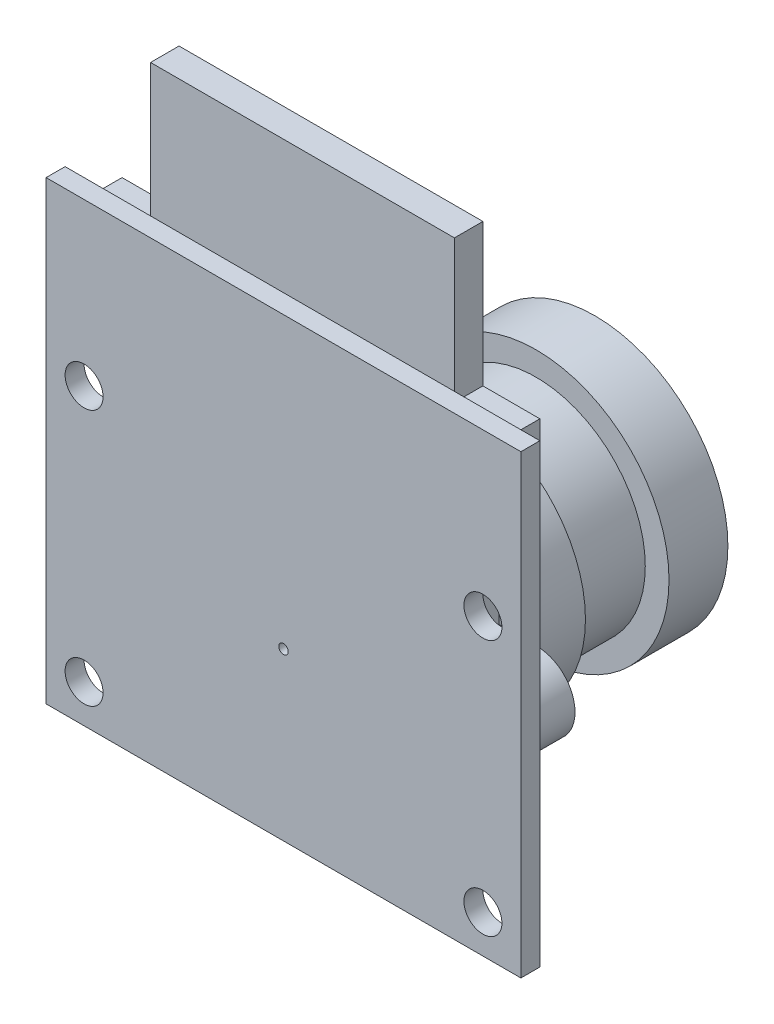
ISO-10303-21;
HEADER;
FILE_DESCRIPTION(('STEP AP214'),'2;1');
FILE_NAME('part.step','',(''),(''),'','','');
FILE_SCHEMA(('AUTOMOTIVE_DESIGN { 1 0 10303 214 1 1 1 1 }'));
ENDSEC;
DATA;
#1=APPLICATION_CONTEXT('core data for automotive mechanical design processes');
#2=APPLICATION_PROTOCOL_DEFINITION('international standard','automotive_design',2000,#1);
#3=PRODUCT_CONTEXT('',#1,'mechanical');
#4=PRODUCT('Part','Part','',(#3));
#5=PRODUCT_RELATED_PRODUCT_CATEGORY('part','',(#4));
#6=PRODUCT_DEFINITION_FORMATION('','',#4);
#7=PRODUCT_DEFINITION_CONTEXT('part definition',#1,'design');
#8=PRODUCT_DEFINITION('design','',#6,#7);
#9=PRODUCT_DEFINITION_SHAPE('','',#8);
#10=(LENGTH_UNIT() NAMED_UNIT(*) SI_UNIT(.MILLI.,.METRE.));
#11=(NAMED_UNIT(*) PLANE_ANGLE_UNIT() SI_UNIT($,.RADIAN.));
#12=(NAMED_UNIT(*) SI_UNIT($,.STERADIAN.) SOLID_ANGLE_UNIT());
#13=UNCERTAINTY_MEASURE_WITH_UNIT(LENGTH_MEASURE(1.E-05),#10,'distance_accuracy_value','');
#14=(GEOMETRIC_REPRESENTATION_CONTEXT(3) GLOBAL_UNCERTAINTY_ASSIGNED_CONTEXT((#13)) GLOBAL_UNIT_ASSIGNED_CONTEXT((#10,
#11,#12)) REPRESENTATION_CONTEXT('',''));
#15=CARTESIAN_POINT('',(0.,0.,0.));
#16=DIRECTION('',(0.,0.,1.));
#17=DIRECTION('',(1.,0.,0.));
#18=AXIS2_PLACEMENT_3D('',#15,#16,#17);
#19=CARTESIAN_POINT('',(0.,0.,-1.));
#20=DIRECTION('',(0.,0.,-1.));
#21=DIRECTION('',(-1.,0.,0.));
#22=AXIS2_PLACEMENT_3D('',#19,#20,#21);
#23=PLANE('',#22);
#24=CARTESIAN_POINT('',(2.,2.,-1.));
#25=DIRECTION('',(0.,0.,-1.));
#26=DIRECTION('',(-1.,0.,0.));
#27=AXIS2_PLACEMENT_3D('',#24,#25,#26);
#28=CIRCLE('',#27,0.999999999999986);
#29=CARTESIAN_POINT('',(1.00000000000001,2.,-1.));
#30=VERTEX_POINT('',#29);
#31=EDGE_CURVE('E39',#30,#30,#28,.T.);
#32=ORIENTED_EDGE('',*,*,#31,.F.);
#33=EDGE_LOOP('',(#32));
#34=FACE_BOUND('',#33,.T.);
#35=CARTESIAN_POINT('',(2.,15.5,-1.));
#36=DIRECTION('',(0.,0.,-1.));
#37=DIRECTION('',(-1.,0.,0.));
#38=AXIS2_PLACEMENT_3D('',#35,#36,#37);
#39=CIRCLE('',#38,0.999999999999986);
#40=CARTESIAN_POINT('',(1.00000000000001,15.5,-1.));
#41=VERTEX_POINT('',#40);
#42=EDGE_CURVE('E252',#41,#41,#39,.T.);
#43=ORIENTED_EDGE('',*,*,#42,.F.);
#44=EDGE_LOOP('',(#43));
#45=FACE_BOUND('',#44,.T.);
#46=CARTESIAN_POINT('',(23.,15.5,-1.));
#47=DIRECTION('',(0.,0.,-1.));
#48=DIRECTION('',(-1.,0.,0.));
#49=AXIS2_PLACEMENT_3D('',#46,#47,#48);
#50=CIRCLE('',#49,0.999999999999987);
#51=CARTESIAN_POINT('',(22.,15.5,-1.));
#52=VERTEX_POINT('',#51);
#53=EDGE_CURVE('E256',#52,#52,#50,.T.);
#54=ORIENTED_EDGE('',*,*,#53,.F.);
#55=EDGE_LOOP('',(#54));
#56=FACE_BOUND('',#55,.T.);
#57=CARTESIAN_POINT('',(23.,2.,-1.));
#58=DIRECTION('',(0.,0.,-1.));
#59=DIRECTION('',(-1.,0.,0.));
#60=AXIS2_PLACEMENT_3D('',#57,#58,#59);
#61=CIRCLE('',#60,0.999999999999987);
#62=CARTESIAN_POINT('',(22.,2.,-1.));
#63=VERTEX_POINT('',#62);
#64=EDGE_CURVE('E260',#63,#63,#61,.T.);
#65=ORIENTED_EDGE('',*,*,#64,.F.);
#66=EDGE_LOOP('',(#65));
#67=FACE_BOUND('',#66,.T.);
#68=DIRECTION('',(1.,0.,0.));
#69=VECTOR('',#68,1.);
#70=CARTESIAN_POINT('',(19.05,15.2999999999799,-1.));
#71=LINE('',#70,#69);
#72=CARTESIAN_POINT('',(5.95,15.2999999999799,-1.));
#73=VERTEX_POINT('',#72);
#74=CARTESIAN_POINT('',(19.05,15.2999999999799,-1.));
#75=VERTEX_POINT('',#74);
#76=EDGE_CURVE('E354',#73,#75,#71,.T.);
#77=ORIENTED_EDGE('',*,*,#76,.F.);
#78=DIRECTION('',(0.,1.,0.));
#79=VECTOR('',#78,1.);
#80=CARTESIAN_POINT('',(5.95,15.2999999999799,-1.));
#81=LINE('',#80,#79);
#82=CARTESIAN_POINT('',(5.95,10.75,-1.));
#83=VERTEX_POINT('',#82);
#84=EDGE_CURVE('E319',#83,#73,#81,.T.);
#85=ORIENTED_EDGE('',*,*,#84,.F.);
#86=DIRECTION('',(1.,0.,0.));
#87=VECTOR('',#86,1.);
#88=CARTESIAN_POINT('',(5.95,10.75,-1.));
#89=LINE('',#88,#87);
#90=CARTESIAN_POINT('',(3.94999511703025,10.75,-1.));
#91=VERTEX_POINT('',#90);
#92=EDGE_CURVE('E324',#91,#83,#89,.T.);
#93=ORIENTED_EDGE('',*,*,#92,.F.);
#94=CARTESIAN_POINT('',(3.94999511703025,8.74999999998993,-1.));
#95=DIRECTION('',(0.,0.,-1.));
#96=DIRECTION('',(1.,0.,0.));
#97=AXIS2_PLACEMENT_3D('',#94,#95,#96);
#98=CIRCLE('',#97,2.00000000001007);
#99=CARTESIAN_POINT('',(3.94999511703025,6.74999999997985,-1.));
#100=VERTEX_POINT('',#99);
#101=EDGE_CURVE('E372',#100,#91,#98,.T.);
#102=ORIENTED_EDGE('',*,*,#101,.F.);
#103=DIRECTION('',(-1.,0.,0.));
#104=VECTOR('',#103,1.);
#105=CARTESIAN_POINT('',(3.94999511703025,6.74999999997985,-1.));
#106=LINE('',#105,#104);
#107=CARTESIAN_POINT('',(5.95,6.74999999997985,-1.));
#108=VERTEX_POINT('',#107);
#109=EDGE_CURVE('E370',#108,#100,#106,.T.);
#110=ORIENTED_EDGE('',*,*,#109,.F.);
#111=DIRECTION('',(0.,1.,0.));
#112=VECTOR('',#111,1.);
#113=CARTESIAN_POINT('',(5.95,6.74999999997985,-1.));
#114=LINE('',#113,#112);
#115=CARTESIAN_POINT('',(5.95,2.19999999997985,-1.));
#116=VERTEX_POINT('',#115);
#117=EDGE_CURVE('E368',#116,#108,#114,.T.);
#118=ORIENTED_EDGE('',*,*,#117,.F.);
#119=DIRECTION('',(-1.,0.,0.));
#120=VECTOR('',#119,1.);
#121=CARTESIAN_POINT('',(5.95,2.19999999997985,-1.));
#122=LINE('',#121,#120);
#123=CARTESIAN_POINT('',(19.05,2.19999999997985,-1.));
#124=VERTEX_POINT('',#123);
#125=EDGE_CURVE('E366',#124,#116,#122,.T.);
#126=ORIENTED_EDGE('',*,*,#125,.F.);
#127=DIRECTION('',(0.,-1.,0.));
#128=VECTOR('',#127,1.);
#129=CARTESIAN_POINT('',(19.05,2.19999999997985,-1.));
#130=LINE('',#129,#128);
#131=CARTESIAN_POINT('',(19.05,6.74999999997985,-1.));
#132=VERTEX_POINT('',#131);
#133=EDGE_CURVE('E364',#132,#124,#130,.T.);
#134=ORIENTED_EDGE('',*,*,#133,.F.);
#135=DIRECTION('',(-1.,0.,0.));
#136=VECTOR('',#135,1.);
#137=CARTESIAN_POINT('',(19.05,6.74999999997985,-1.));
#138=LINE('',#137,#136);
#139=CARTESIAN_POINT('',(21.0500097660236,6.74999999997985,-1.));
#140=VERTEX_POINT('',#139);
#141=EDGE_CURVE('E362',#140,#132,#138,.T.);
#142=ORIENTED_EDGE('',*,*,#141,.F.);
#143=CARTESIAN_POINT('',(21.0500097660236,8.74999999998993,-1.));
#144=DIRECTION('',(0.,0.,-1.));
#145=DIRECTION('',(1.,0.,0.));
#146=AXIS2_PLACEMENT_3D('',#143,#144,#145);
#147=CIRCLE('',#146,2.00000000001008);
#148=CARTESIAN_POINT('',(21.0500097660236,10.75,-1.));
#149=VERTEX_POINT('',#148);
#150=EDGE_CURVE('E360',#149,#140,#147,.T.);
#151=ORIENTED_EDGE('',*,*,#150,.F.);
#152=DIRECTION('',(1.,0.,0.));
#153=VECTOR('',#152,1.);
#154=CARTESIAN_POINT('',(21.0500097660236,10.75,-1.));
#155=LINE('',#154,#153);
#156=CARTESIAN_POINT('',(19.05,10.75,-1.));
#157=VERTEX_POINT('',#156);
#158=EDGE_CURVE('E358',#157,#149,#155,.T.);
#159=ORIENTED_EDGE('',*,*,#158,.F.);
#160=DIRECTION('',(0.,-1.,0.));
#161=VECTOR('',#160,1.);
#162=CARTESIAN_POINT('',(19.05,10.75,-1.));
#163=LINE('',#162,#161);
#164=EDGE_CURVE('E356',#75,#157,#163,.T.);
#165=ORIENTED_EDGE('',*,*,#164,.F.);
#166=EDGE_LOOP('',(#77,#85,#93,#102,#110,#118,#126,#134,#142,#151,#159,#165));
#167=FACE_BOUND('',#166,.T.);
#168=DIRECTION('',(1.,0.,0.));
#169=VECTOR('',#168,1.);
#170=CARTESIAN_POINT('',(0.,24.,-1.));
#171=LINE('',#170,#169);
#172=CARTESIAN_POINT('',(0.,24.,-1.));
#173=VERTEX_POINT('',#172);
#174=CARTESIAN_POINT('',(4.5,24.,-1.));
#175=VERTEX_POINT('',#174);
#176=EDGE_CURVE('E414',#173,#175,#171,.T.);
#177=ORIENTED_EDGE('',*,*,#176,.T.);
#178=DIRECTION('',(0.,-1.,0.));
#179=VECTOR('',#178,1.);
#180=CARTESIAN_POINT('',(4.5,31.,-1.));
#181=LINE('',#180,#179);
#182=CARTESIAN_POINT('',(4.5,23.5,-1.));
#183=VERTEX_POINT('',#182);
#184=EDGE_CURVE('E239',#175,#183,#181,.T.);
#185=ORIENTED_EDGE('',*,*,#184,.T.);
#186=DIRECTION('',(1.,0.,0.));
#187=VECTOR('',#186,1.);
#188=CARTESIAN_POINT('',(23.5,23.5,-1.));
#189=LINE('',#188,#187);
#190=CARTESIAN_POINT('',(1.5,23.5,-1.));
#191=VERTEX_POINT('',#190);
#192=EDGE_CURVE('E305',#191,#183,#189,.T.);
#193=ORIENTED_EDGE('',*,*,#192,.F.);
#194=DIRECTION('',(0.,1.,0.));
#195=VECTOR('',#194,1.);
#196=CARTESIAN_POINT('',(1.5,23.5,-1.));
#197=LINE('',#196,#195);
#198=CARTESIAN_POINT('',(1.5,18.6977042974412,-1.));
#199=VERTEX_POINT('',#198);
#200=EDGE_CURVE('E302',#199,#191,#197,.T.);
#201=ORIENTED_EDGE('',*,*,#200,.F.);
#202=DIRECTION('',(-1.,0.,0.));
#203=VECTOR('',#202,1.);
#204=CARTESIAN_POINT('',(1.5,18.6977042974412,-1.));
#205=LINE('',#204,#203);
#206=CARTESIAN_POINT('',(23.5,18.6977042974412,-1.));
#207=VERTEX_POINT('',#206);
#208=EDGE_CURVE('E286',#207,#199,#205,.T.);
#209=ORIENTED_EDGE('',*,*,#208,.F.);
#210=DIRECTION('',(0.,-1.,0.));
#211=VECTOR('',#210,1.);
#212=CARTESIAN_POINT('',(23.5,18.6977042974412,-1.));
#213=LINE('',#212,#211);
#214=CARTESIAN_POINT('',(23.5,23.5,-1.));
#215=VERTEX_POINT('',#214);
#216=EDGE_CURVE('E291',#215,#207,#213,.T.);
#217=ORIENTED_EDGE('',*,*,#216,.F.);
#218=CARTESIAN_POINT('',(20.5,23.5,-1.));
#219=VERTEX_POINT('',#218);
#220=EDGE_CURVE('E304',#219,#215,#189,.T.);
#221=ORIENTED_EDGE('',*,*,#220,.F.);
#222=DIRECTION('',(0.,-1.,0.));
#223=VECTOR('',#222,1.);
#224=CARTESIAN_POINT('',(20.5,31.,-1.));
#225=LINE('',#224,#223);
#226=CARTESIAN_POINT('',(20.5,24.,-1.));
#227=VERTEX_POINT('',#226);
#228=EDGE_CURVE('E472',#227,#219,#225,.T.);
#229=ORIENTED_EDGE('',*,*,#228,.F.);
#230=CARTESIAN_POINT('',(25.,24.,-1.));
#231=VERTEX_POINT('',#230);
#232=EDGE_CURVE('E432',#227,#231,#171,.T.);
#233=ORIENTED_EDGE('',*,*,#232,.T.);
#234=DIRECTION('',(0.,-1.,0.));
#235=VECTOR('',#234,1.);
#236=CARTESIAN_POINT('',(25.,24.,-1.));
#237=LINE('',#236,#235);
#238=CARTESIAN_POINT('',(25.,0.,-1.));
#239=VERTEX_POINT('',#238);
#240=EDGE_CURVE('E409',#231,#239,#237,.T.);
#241=ORIENTED_EDGE('',*,*,#240,.T.);
#242=DIRECTION('',(-1.,0.,0.));
#243=VECTOR('',#242,1.);
#244=CARTESIAN_POINT('',(25.,0.,-1.));
#245=LINE('',#244,#243);
#246=CARTESIAN_POINT('',(0.,0.,-1.));
#247=VERTEX_POINT('',#246);
#248=EDGE_CURVE('E426',#239,#247,#245,.T.);
#249=ORIENTED_EDGE('',*,*,#248,.T.);
#250=DIRECTION('',(0.,1.,0.));
#251=VECTOR('',#250,1.);
#252=CARTESIAN_POINT('',(0.,0.,-1.));
#253=LINE('',#252,#251);
#254=EDGE_CURVE('E429',#247,#173,#253,.T.);
#255=ORIENTED_EDGE('',*,*,#254,.T.);
#256=EDGE_LOOP('',(#177,#185,#193,#201,#209,#217,#221,#229,#233,#241,#249,#255));
#257=FACE_BOUND('',#256,.T.);
#258=ADVANCED_FACE('F35',(#34,#45,#56,#67,#167,#257),#23,.T.);
#259=CARTESIAN_POINT('',(23.5,23.5,-2.5));
#260=DIRECTION('',(0.,-1.,0.));
#261=DIRECTION('',(0.,0.,-1.));
#262=AXIS2_PLACEMENT_3D('',#259,#260,#261);
#263=PLANE('',#262);
#264=DIRECTION('',(0.,0.,1.));
#265=VECTOR('',#264,1.);
#266=CARTESIAN_POINT('',(4.5,23.5,-2.5));
#267=LINE('',#266,#265);
#268=CARTESIAN_POINT('',(4.5,23.5,-2.5));
#269=VERTEX_POINT('',#268);
#270=EDGE_CURVE('E480',#269,#183,#267,.T.);
#271=ORIENTED_EDGE('',*,*,#270,.F.);
#272=DIRECTION('',(1.,0.,0.));
#273=VECTOR('',#272,1.);
#274=CARTESIAN_POINT('',(23.5,23.5,-2.5));
#275=LINE('',#274,#273);
#276=CARTESIAN_POINT('',(1.5,23.5,-2.5));
#277=VERTEX_POINT('',#276);
#278=EDGE_CURVE('E294',#277,#269,#275,.T.);
#279=ORIENTED_EDGE('',*,*,#278,.F.);
#280=DIRECTION('',(0.,0.,1.));
#281=VECTOR('',#280,1.);
#282=CARTESIAN_POINT('',(1.5,23.5,-2.5));
#283=LINE('',#282,#281);
#284=EDGE_CURVE('E314',#277,#191,#283,.T.);
#285=ORIENTED_EDGE('',*,*,#284,.T.);
#286=ORIENTED_EDGE('',*,*,#192,.T.);
#287=EDGE_LOOP('',(#271,#279,#285,#286));
#288=FACE_BOUND('',#287,.T.);
#289=ADVANCED_FACE('F452',(#288),#263,.F.);
#290=DIRECTION('',(0.,0.,-1.));
#291=VECTOR('',#290,1.);
#292=CARTESIAN_POINT('',(20.5,23.5,-2.5));
#293=LINE('',#292,#291);
#294=CARTESIAN_POINT('',(20.5,23.5,-2.5));
#295=VERTEX_POINT('',#294);
#296=EDGE_CURVE('E235',#219,#295,#293,.T.);
#297=ORIENTED_EDGE('',*,*,#296,.F.);
#298=ORIENTED_EDGE('',*,*,#220,.T.);
#299=DIRECTION('',(0.,0.,1.));
#300=VECTOR('',#299,1.);
#301=CARTESIAN_POINT('',(23.5,23.5,-2.5));
#302=LINE('',#301,#300);
#303=CARTESIAN_POINT('',(23.5,23.5,-2.5));
#304=VERTEX_POINT('',#303);
#305=EDGE_CURVE('E311',#304,#215,#302,.T.);
#306=ORIENTED_EDGE('',*,*,#305,.F.);
#307=EDGE_CURVE('E293',#295,#304,#275,.T.);
#308=ORIENTED_EDGE('',*,*,#307,.F.);
#309=EDGE_LOOP('',(#297,#298,#306,#308));
#310=FACE_BOUND('',#309,.T.);
#311=ADVANCED_FACE('F503',(#310),#263,.F.);
#312=CARTESIAN_POINT('',(3.94999511703025,8.74999999998993,-4.8));
#313=DIRECTION('',(0.,0.,1.));
#314=DIRECTION('',(1.,0.,0.));
#315=AXIS2_PLACEMENT_3D('',#312,#313,#314);
#316=PLANE('',#315);
#317=CARTESIAN_POINT('',(12.5,8.75,-4.8));
#318=DIRECTION('',(0.,0.,-1.));
#319=DIRECTION('',(-1.,0.,0.));
#320=AXIS2_PLACEMENT_3D('',#317,#318,#319);
#321=CIRCLE('',#320,6.6);
#322=CARTESIAN_POINT('',(13.3108637371741,15.2999999999798,-4.8));
#323=VERTEX_POINT('',#322);
#324=CARTESIAN_POINT('',(13.3108637368486,2.19999999997985,-4.8));
#325=VERTEX_POINT('',#324);
#326=EDGE_CURVE('E11',#323,#325,#321,.T.);
#327=ORIENTED_EDGE('',*,*,#326,.F.);
#328=DIRECTION('',(1.,0.,0.));
#329=VECTOR('',#328,1.);
#330=CARTESIAN_POINT('',(19.05,15.2999999999799,-4.8));
#331=LINE('',#330,#329);
#332=CARTESIAN_POINT('',(19.05,15.2999999999799,-4.8));
#333=VERTEX_POINT('',#332);
#334=EDGE_CURVE('E323',#323,#333,#331,.T.);
#335=ORIENTED_EDGE('',*,*,#334,.T.);
#336=DIRECTION('',(0.,-1.,0.));
#337=VECTOR('',#336,1.);
#338=CARTESIAN_POINT('',(19.05,10.75,-4.8));
#339=LINE('',#338,#337);
#340=CARTESIAN_POINT('',(19.05,10.75,-4.8));
#341=VERTEX_POINT('',#340);
#342=EDGE_CURVE('E327',#333,#341,#339,.T.);
#343=ORIENTED_EDGE('',*,*,#342,.T.);
#344=DIRECTION('',(1.,0.,0.));
#345=VECTOR('',#344,1.);
#346=CARTESIAN_POINT('',(21.0500097660236,10.75,-4.8));
#347=LINE('',#346,#345);
#348=CARTESIAN_POINT('',(21.0500097660236,10.75,-4.8));
#349=VERTEX_POINT('',#348);
#350=EDGE_CURVE('E330',#341,#349,#347,.T.);
#351=ORIENTED_EDGE('',*,*,#350,.T.);
#352=CARTESIAN_POINT('',(21.0500097660236,8.74999999998993,-4.8));
#353=DIRECTION('',(0.,0.,-1.));
#354=DIRECTION('',(1.,0.,0.));
#355=AXIS2_PLACEMENT_3D('',#352,#353,#354);
#356=CIRCLE('',#355,2.00000000001008);
#357=CARTESIAN_POINT('',(21.0500097660236,6.74999999997985,-4.8));
#358=VERTEX_POINT('',#357);
#359=EDGE_CURVE('E332',#349,#358,#356,.T.);
#360=ORIENTED_EDGE('',*,*,#359,.T.);
#361=DIRECTION('',(-1.,0.,0.));
#362=VECTOR('',#361,1.);
#363=CARTESIAN_POINT('',(19.05,6.74999999997985,-4.8));
#364=LINE('',#363,#362);
#365=CARTESIAN_POINT('',(19.05,6.74999999997985,-4.8));
#366=VERTEX_POINT('',#365);
#367=EDGE_CURVE('E334',#358,#366,#364,.T.);
#368=ORIENTED_EDGE('',*,*,#367,.T.);
#369=DIRECTION('',(0.,-1.,0.));
#370=VECTOR('',#369,1.);
#371=CARTESIAN_POINT('',(19.05,2.19999999997985,-4.8));
#372=LINE('',#371,#370);
#373=CARTESIAN_POINT('',(19.05,2.19999999997985,-4.8));
#374=VERTEX_POINT('',#373);
#375=EDGE_CURVE('E336',#366,#374,#372,.T.);
#376=ORIENTED_EDGE('',*,*,#375,.T.);
#377=DIRECTION('',(-1.,0.,0.));
#378=VECTOR('',#377,1.);
#379=CARTESIAN_POINT('',(5.95,2.19999999997985,-4.8));
#380=LINE('',#379,#378);
#381=EDGE_CURVE('E339',#374,#325,#380,.T.);
#382=ORIENTED_EDGE('',*,*,#381,.T.);
#383=EDGE_LOOP('',(#327,#335,#343,#351,#360,#368,#376,#382));
#384=FACE_BOUND('',#383,.T.);
#385=ADVANCED_FACE('F505',(#384),#316,.F.);
#386=CARTESIAN_POINT('',(25.,24.,0.));
#387=DIRECTION('',(1.,0.,0.));
#388=DIRECTION('',(0.,0.,-1.));
#389=AXIS2_PLACEMENT_3D('',#386,#387,#388);
#390=PLANE('',#389);
#391=ORIENTED_EDGE('',*,*,#240,.F.);
#392=DIRECTION('',(0.,0.,-1.));
#393=VECTOR('',#392,1.);
#394=CARTESIAN_POINT('',(25.,24.,0.));
#395=LINE('',#394,#393);
#396=CARTESIAN_POINT('',(25.,24.,0.));
#397=VERTEX_POINT('',#396);
#398=EDGE_CURVE('E435',#397,#231,#395,.T.);
#399=ORIENTED_EDGE('',*,*,#398,.F.);
#400=DIRECTION('',(0.,-1.,0.));
#401=VECTOR('',#400,1.);
#402=CARTESIAN_POINT('',(25.,24.,0.));
#403=LINE('',#402,#401);
#404=CARTESIAN_POINT('',(25.,0.,0.));
#405=VERTEX_POINT('',#404);
#406=EDGE_CURVE('E410',#397,#405,#403,.T.);
#407=ORIENTED_EDGE('',*,*,#406,.T.);
#408=DIRECTION('',(0.,0.,-1.));
#409=VECTOR('',#408,1.);
#410=CARTESIAN_POINT('',(25.,0.,0.));
#411=LINE('',#410,#409);
#412=EDGE_CURVE('E423',#405,#239,#411,.T.);
#413=ORIENTED_EDGE('',*,*,#412,.T.);
#414=EDGE_LOOP('',(#391,#399,#407,#413));
#415=FACE_BOUND('',#414,.T.);
#416=ADVANCED_FACE('F37',(#415),#390,.T.);
#417=CARTESIAN_POINT('',(0.,24.,0.));
#418=DIRECTION('',(0.,1.,0.));
#419=DIRECTION('',(0.,0.,1.));
#420=AXIS2_PLACEMENT_3D('',#417,#418,#419);
#421=PLANE('',#420);
#422=ORIENTED_EDGE('',*,*,#176,.F.);
#423=DIRECTION('',(0.,0.,-1.));
#424=VECTOR('',#423,1.);
#425=CARTESIAN_POINT('',(0.,24.,0.));
#426=LINE('',#425,#424);
#427=CARTESIAN_POINT('',(0.,24.,0.));
#428=VERTEX_POINT('',#427);
#429=EDGE_CURVE('E438',#428,#173,#426,.T.);
#430=ORIENTED_EDGE('',*,*,#429,.F.);
#431=DIRECTION('',(1.,0.,0.));
#432=VECTOR('',#431,1.);
#433=CARTESIAN_POINT('',(0.,24.,0.));
#434=LINE('',#433,#432);
#435=EDGE_CURVE('E420',#428,#397,#434,.T.);
#436=ORIENTED_EDGE('',*,*,#435,.T.);
#437=ORIENTED_EDGE('',*,*,#398,.T.);
#438=ORIENTED_EDGE('',*,*,#232,.F.);
#439=DIRECTION('',(-1.,0.,0.));
#440=VECTOR('',#439,1.);
#441=CARTESIAN_POINT('',(0.,24.,-0.999999999999999));
#442=LINE('',#441,#440);
#443=EDGE_CURVE('E240',#227,#175,#442,.T.);
#444=ORIENTED_EDGE('',*,*,#443,.T.);
#445=EDGE_LOOP('',(#422,#430,#436,#437,#438,#444));
#446=FACE_BOUND('',#445,.T.);
#447=ADVANCED_FACE('F467',(#446),#421,.T.);
#448=CARTESIAN_POINT('',(0.,0.,0.));
#449=DIRECTION('',(-1.,0.,0.));
#450=DIRECTION('',(0.,0.,1.));
#451=AXIS2_PLACEMENT_3D('',#448,#449,#450);
#452=PLANE('',#451);
#453=ORIENTED_EDGE('',*,*,#254,.F.);
#454=DIRECTION('',(0.,0.,-1.));
#455=VECTOR('',#454,1.);
#456=CARTESIAN_POINT('',(0.,0.,0.));
#457=LINE('',#456,#455);
#458=CARTESIAN_POINT('',(0.,0.,0.));
#459=VERTEX_POINT('',#458);
#460=EDGE_CURVE('E440',#459,#247,#457,.T.);
#461=ORIENTED_EDGE('',*,*,#460,.F.);
#462=DIRECTION('',(0.,1.,0.));
#463=VECTOR('',#462,1.);
#464=CARTESIAN_POINT('',(0.,0.,0.));
#465=LINE('',#464,#463);
#466=EDGE_CURVE('E417',#459,#428,#465,.T.);
#467=ORIENTED_EDGE('',*,*,#466,.T.);
#468=ORIENTED_EDGE('',*,*,#429,.T.);
#469=EDGE_LOOP('',(#453,#461,#467,#468));
#470=FACE_BOUND('',#469,.T.);
#471=ADVANCED_FACE('F577',(#470),#452,.T.);
#472=CARTESIAN_POINT('',(25.,0.,0.));
#473=DIRECTION('',(0.,-1.,0.));
#474=DIRECTION('',(0.,0.,-1.));
#475=AXIS2_PLACEMENT_3D('',#472,#473,#474);
#476=PLANE('',#475);
#477=ORIENTED_EDGE('',*,*,#248,.F.);
#478=ORIENTED_EDGE('',*,*,#412,.F.);
#479=DIRECTION('',(-1.,0.,0.));
#480=VECTOR('',#479,1.);
#481=CARTESIAN_POINT('',(25.,0.,0.));
#482=LINE('',#481,#480);
#483=EDGE_CURVE('E413',#405,#459,#482,.T.);
#484=ORIENTED_EDGE('',*,*,#483,.T.);
#485=ORIENTED_EDGE('',*,*,#460,.T.);
#486=EDGE_LOOP('',(#477,#478,#484,#485));
#487=FACE_BOUND('',#486,.T.);
#488=ADVANCED_FACE('F572',(#487),#476,.T.);
#489=CARTESIAN_POINT('',(0.,0.,0.));
#490=DIRECTION('',(0.,0.,-1.));
#491=DIRECTION('',(-1.,0.,0.));
#492=AXIS2_PLACEMENT_3D('',#489,#490,#491);
#493=PLANE('',#492);
#494=CARTESIAN_POINT('',(2.,2.,0.));
#495=DIRECTION('',(0.,0.,1.));
#496=DIRECTION('',(1.,0.,0.));
#497=AXIS2_PLACEMENT_3D('',#494,#495,#496);
#498=CIRCLE('',#497,0.999999999999987);
#499=CARTESIAN_POINT('',(2.99999999999999,2.,0.));
#500=VERTEX_POINT('',#499);
#501=EDGE_CURVE('E242',#500,#500,#498,.T.);
#502=ORIENTED_EDGE('',*,*,#501,.F.);
#503=EDGE_LOOP('',(#502));
#504=FACE_BOUND('',#503,.T.);
#505=CARTESIAN_POINT('',(2.,15.5,0.));
#506=DIRECTION('',(0.,0.,1.));
#507=DIRECTION('',(1.,0.,0.));
#508=AXIS2_PLACEMENT_3D('',#505,#506,#507);
#509=CIRCLE('',#508,0.999999999999987);
#510=CARTESIAN_POINT('',(2.99999999999999,15.5,0.));
#511=VERTEX_POINT('',#510);
#512=EDGE_CURVE('E249',#511,#511,#509,.T.);
#513=ORIENTED_EDGE('',*,*,#512,.F.);
#514=EDGE_LOOP('',(#513));
#515=FACE_BOUND('',#514,.T.);
#516=CARTESIAN_POINT('',(23.,15.5,0.));
#517=DIRECTION('',(0.,0.,1.));
#518=DIRECTION('',(1.,0.,0.));
#519=AXIS2_PLACEMENT_3D('',#516,#517,#518);
#520=CIRCLE('',#519,0.999999999999987);
#521=CARTESIAN_POINT('',(24.,15.5,0.));
#522=VERTEX_POINT('',#521);
#523=EDGE_CURVE('E253',#522,#522,#520,.T.);
#524=ORIENTED_EDGE('',*,*,#523,.F.);
#525=EDGE_LOOP('',(#524));
#526=FACE_BOUND('',#525,.T.);
#527=CARTESIAN_POINT('',(23.,2.,0.));
#528=DIRECTION('',(0.,0.,1.));
#529=DIRECTION('',(1.,0.,0.));
#530=AXIS2_PLACEMENT_3D('',#527,#528,#529);
#531=CIRCLE('',#530,0.999999999999987);
#532=CARTESIAN_POINT('',(24.,2.,0.));
#533=VERTEX_POINT('',#532);
#534=EDGE_CURVE('E257',#533,#533,#531,.T.);
#535=ORIENTED_EDGE('',*,*,#534,.F.);
#536=EDGE_LOOP('',(#535));
#537=FACE_BOUND('',#536,.T.);
#538=CARTESIAN_POINT('',(12.5,8.75,0.));
#539=DIRECTION('',(0.,0.,1.));
#540=DIRECTION('',(1.,0.,0.));
#541=AXIS2_PLACEMENT_3D('',#538,#539,#540);
#542=CIRCLE('',#541,0.24999999999999);
#543=CARTESIAN_POINT('',(12.75,8.75,0.));
#544=VERTEX_POINT('',#543);
#545=EDGE_CURVE('E263',#544,#544,#542,.T.);
#546=ORIENTED_EDGE('',*,*,#545,.F.);
#547=EDGE_LOOP('',(#546));
#548=FACE_BOUND('',#547,.T.);
#549=ORIENTED_EDGE('',*,*,#406,.F.);
#550=ORIENTED_EDGE('',*,*,#435,.F.);
#551=ORIENTED_EDGE('',*,*,#466,.F.);
#552=ORIENTED_EDGE('',*,*,#483,.F.);
#553=EDGE_LOOP('',(#549,#550,#551,#552));
#554=FACE_BOUND('',#553,.T.);
#555=ADVANCED_FACE('F569',(#504,#515,#526,#537,#548,#554),#493,.F.);
#556=CARTESIAN_POINT('',(5.95,15.2999999999799,-4.8));
#557=DIRECTION('',(1.,0.,0.));
#558=DIRECTION('',(0.,0.,-1.));
#559=AXIS2_PLACEMENT_3D('',#556,#557,#558);
#560=PLANE('',#559);
#561=ORIENTED_EDGE('',*,*,#84,.T.);
#562=DIRECTION('',(0.,0.,1.));
#563=VECTOR('',#562,1.);
#564=CARTESIAN_POINT('',(5.95,15.2999999999799,-4.8));
#565=LINE('',#564,#563);
#566=CARTESIAN_POINT('',(5.95,15.2999999999799,-4.8));
#567=VERTEX_POINT('',#566);
#568=EDGE_CURVE('E407',#567,#73,#565,.T.);
#569=ORIENTED_EDGE('',*,*,#568,.F.);
#570=DIRECTION('',(0.,1.,0.));
#571=VECTOR('',#570,1.);
#572=CARTESIAN_POINT('',(5.95,15.2999999999799,-4.8));
#573=LINE('',#572,#571);
#574=CARTESIAN_POINT('',(5.95,10.75,-4.8));
#575=VERTEX_POINT('',#574);
#576=EDGE_CURVE('E320',#575,#567,#573,.T.);
#577=ORIENTED_EDGE('',*,*,#576,.F.);
#578=DIRECTION('',(0.,0.,1.));
#579=VECTOR('',#578,1.);
#580=CARTESIAN_POINT('',(5.95,10.75,-4.8));
#581=LINE('',#580,#579);
#582=EDGE_CURVE('E351',#575,#83,#581,.T.);
#583=ORIENTED_EDGE('',*,*,#582,.T.);
#584=EDGE_LOOP('',(#561,#569,#577,#583));
#585=FACE_BOUND('',#584,.T.);
#586=ADVANCED_FACE('F565',(#585),#560,.F.);
#587=CARTESIAN_POINT('',(19.05,15.2999999999799,-4.8));
#588=DIRECTION('',(0.,-1.,0.));
#589=DIRECTION('',(0.,0.,-1.));
#590=AXIS2_PLACEMENT_3D('',#587,#588,#589);
#591=PLANE('',#590);
#592=ORIENTED_EDGE('',*,*,#76,.T.);
#593=DIRECTION('',(0.,0.,1.));
#594=VECTOR('',#593,1.);
#595=CARTESIAN_POINT('',(19.05,15.2999999999799,-4.8));
#596=LINE('',#595,#594);
#597=EDGE_CURVE('E404',#333,#75,#596,.T.);
#598=ORIENTED_EDGE('',*,*,#597,.F.);
#599=ORIENTED_EDGE('',*,*,#334,.F.);
#600=CARTESIAN_POINT('',(11.6891362628259,15.2999999999798,-4.8));
#601=VERTEX_POINT('',#600);
#602=EDGE_CURVE('E328',#601,#323,#331,.T.);
#603=ORIENTED_EDGE('',*,*,#602,.F.);
#604=EDGE_CURVE('E325',#567,#601,#331,.T.);
#605=ORIENTED_EDGE('',*,*,#604,.F.);
#606=ORIENTED_EDGE('',*,*,#568,.T.);
#607=EDGE_LOOP('',(#592,#598,#599,#603,#605,#606));
#608=FACE_BOUND('',#607,.T.);
#609=ADVANCED_FACE('F561',(#608),#591,.F.);
#610=CARTESIAN_POINT('',(19.05,10.75,-4.8));
#611=DIRECTION('',(-1.,0.,0.));
#612=DIRECTION('',(0.,0.,1.));
#613=AXIS2_PLACEMENT_3D('',#610,#611,#612);
#614=PLANE('',#613);
#615=ORIENTED_EDGE('',*,*,#164,.T.);
#616=DIRECTION('',(0.,0.,1.));
#617=VECTOR('',#616,1.);
#618=CARTESIAN_POINT('',(19.05,10.75,-4.8));
#619=LINE('',#618,#617);
#620=EDGE_CURVE('E401',#341,#157,#619,.T.);
#621=ORIENTED_EDGE('',*,*,#620,.F.);
#622=ORIENTED_EDGE('',*,*,#342,.F.);
#623=ORIENTED_EDGE('',*,*,#597,.T.);
#624=EDGE_LOOP('',(#615,#621,#622,#623));
#625=FACE_BOUND('',#624,.T.);
#626=ADVANCED_FACE('F557',(#625),#614,.F.);
#627=CARTESIAN_POINT('',(21.0500097660236,10.75,-4.8));
#628=DIRECTION('',(0.,-1.,0.));
#629=DIRECTION('',(1.,0.,0.));
#630=AXIS2_PLACEMENT_3D('',#627,#628,#629);
#631=PLANE('',#630);
#632=ORIENTED_EDGE('',*,*,#158,.T.);
#633=DIRECTION('',(0.,0.,1.));
#634=VECTOR('',#633,1.);
#635=CARTESIAN_POINT('',(21.0500097660236,10.75,-4.8));
#636=LINE('',#635,#634);
#637=EDGE_CURVE('E398',#349,#149,#636,.T.);
#638=ORIENTED_EDGE('',*,*,#637,.F.);
#639=ORIENTED_EDGE('',*,*,#350,.F.);
#640=ORIENTED_EDGE('',*,*,#620,.T.);
#641=EDGE_LOOP('',(#632,#638,#639,#640));
#642=FACE_BOUND('',#641,.T.);
#643=ADVANCED_FACE('F553',(#642),#631,.F.);
#644=CARTESIAN_POINT('',(21.0500097660236,8.74999999998993,-4.8));
#645=DIRECTION('',(0.,0.,1.));
#646=DIRECTION('',(1.,0.,0.));
#647=AXIS2_PLACEMENT_3D('',#644,#645,#646);
#648=CYLINDRICAL_SURFACE('',#647,2.00000000001008);
#649=ORIENTED_EDGE('',*,*,#150,.T.);
#650=DIRECTION('',(0.,0.,1.));
#651=VECTOR('',#650,1.);
#652=CARTESIAN_POINT('',(21.0500097660236,6.74999999997985,-4.8));
#653=LINE('',#652,#651);
#654=EDGE_CURVE('E395',#358,#140,#653,.T.);
#655=ORIENTED_EDGE('',*,*,#654,.F.);
#656=ORIENTED_EDGE('',*,*,#359,.F.);
#657=ORIENTED_EDGE('',*,*,#637,.T.);
#658=EDGE_LOOP('',(#649,#655,#656,#657));
#659=FACE_BOUND('',#658,.T.);
#660=ADVANCED_FACE('F549',(#659),#648,.T.);
#661=CARTESIAN_POINT('',(19.05,6.74999999997985,-4.8));
#662=DIRECTION('',(0.,1.,0.));
#663=DIRECTION('',(-1.,0.,0.));
#664=AXIS2_PLACEMENT_3D('',#661,#662,#663);
#665=PLANE('',#664);
#666=ORIENTED_EDGE('',*,*,#141,.T.);
#667=DIRECTION('',(0.,0.,1.));
#668=VECTOR('',#667,1.);
#669=CARTESIAN_POINT('',(19.05,6.74999999997985,-4.8));
#670=LINE('',#669,#668);
#671=EDGE_CURVE('E392',#366,#132,#670,.T.);
#672=ORIENTED_EDGE('',*,*,#671,.F.);
#673=ORIENTED_EDGE('',*,*,#367,.F.);
#674=ORIENTED_EDGE('',*,*,#654,.T.);
#675=EDGE_LOOP('',(#666,#672,#673,#674));
#676=FACE_BOUND('',#675,.T.);
#677=ADVANCED_FACE('F545',(#676),#665,.F.);
#678=CARTESIAN_POINT('',(19.05,2.19999999997985,-4.8));
#679=DIRECTION('',(-1.,0.,0.));
#680=DIRECTION('',(0.,0.,1.));
#681=AXIS2_PLACEMENT_3D('',#678,#679,#680);
#682=PLANE('',#681);
#683=ORIENTED_EDGE('',*,*,#133,.T.);
#684=DIRECTION('',(0.,0.,1.));
#685=VECTOR('',#684,1.);
#686=CARTESIAN_POINT('',(19.05,2.19999999997985,-4.8));
#687=LINE('',#686,#685);
#688=EDGE_CURVE('E389',#374,#124,#687,.T.);
#689=ORIENTED_EDGE('',*,*,#688,.F.);
#690=ORIENTED_EDGE('',*,*,#375,.F.);
#691=ORIENTED_EDGE('',*,*,#671,.T.);
#692=EDGE_LOOP('',(#683,#689,#690,#691));
#693=FACE_BOUND('',#692,.T.);
#694=ADVANCED_FACE('F541',(#693),#682,.F.);
#695=CARTESIAN_POINT('',(5.95,2.19999999997985,-4.8));
#696=DIRECTION('',(0.,1.,0.));
#697=DIRECTION('',(-1.,0.,0.));
#698=AXIS2_PLACEMENT_3D('',#695,#696,#697);
#699=PLANE('',#698);
#700=ORIENTED_EDGE('',*,*,#125,.T.);
#701=DIRECTION('',(0.,0.,1.));
#702=VECTOR('',#701,1.);
#703=CARTESIAN_POINT('',(5.95,2.19999999997985,-4.8));
#704=LINE('',#703,#702);
#705=CARTESIAN_POINT('',(5.95,2.19999999997985,-4.8));
#706=VERTEX_POINT('',#705);
#707=EDGE_CURVE('E386',#706,#116,#704,.T.);
#708=ORIENTED_EDGE('',*,*,#707,.F.);
#709=CARTESIAN_POINT('',(11.6891362631514,2.19999999997985,-4.8));
#710=VERTEX_POINT('',#709);
#711=EDGE_CURVE('E338',#710,#706,#380,.T.);
#712=ORIENTED_EDGE('',*,*,#711,.F.);
#713=EDGE_CURVE('E343',#325,#710,#380,.T.);
#714=ORIENTED_EDGE('',*,*,#713,.F.);
#715=ORIENTED_EDGE('',*,*,#381,.F.);
#716=ORIENTED_EDGE('',*,*,#688,.T.);
#717=EDGE_LOOP('',(#700,#708,#712,#714,#715,#716));
#718=FACE_BOUND('',#717,.T.);
#719=ADVANCED_FACE('F537',(#718),#699,.F.);
#720=CARTESIAN_POINT('',(5.95,6.74999999997985,-4.8));
#721=DIRECTION('',(1.,0.,0.));
#722=DIRECTION('',(0.,0.,-1.));
#723=AXIS2_PLACEMENT_3D('',#720,#721,#722);
#724=PLANE('',#723);
#725=ORIENTED_EDGE('',*,*,#117,.T.);
#726=DIRECTION('',(0.,0.,1.));
#727=VECTOR('',#726,1.);
#728=CARTESIAN_POINT('',(5.95,6.74999999997985,-4.8));
#729=LINE('',#728,#727);
#730=CARTESIAN_POINT('',(5.95,6.74999999997985,-4.8));
#731=VERTEX_POINT('',#730);
#732=EDGE_CURVE('E383',#731,#108,#729,.T.);
#733=ORIENTED_EDGE('',*,*,#732,.F.);
#734=DIRECTION('',(0.,1.,0.));
#735=VECTOR('',#734,1.);
#736=CARTESIAN_POINT('',(5.95,6.74999999997985,-4.8));
#737=LINE('',#736,#735);
#738=EDGE_CURVE('E342',#706,#731,#737,.T.);
#739=ORIENTED_EDGE('',*,*,#738,.F.);
#740=ORIENTED_EDGE('',*,*,#707,.T.);
#741=EDGE_LOOP('',(#725,#733,#739,#740));
#742=FACE_BOUND('',#741,.T.);
#743=ADVANCED_FACE('F533',(#742),#724,.F.);
#744=CARTESIAN_POINT('',(3.94999511703025,6.74999999997985,-4.8));
#745=DIRECTION('',(0.,1.,0.));
#746=DIRECTION('',(-1.,0.,0.));
#747=AXIS2_PLACEMENT_3D('',#744,#745,#746);
#748=PLANE('',#747);
#749=ORIENTED_EDGE('',*,*,#109,.T.);
#750=DIRECTION('',(0.,0.,1.));
#751=VECTOR('',#750,1.);
#752=CARTESIAN_POINT('',(3.94999511703025,6.74999999997985,-4.8));
#753=LINE('',#752,#751);
#754=CARTESIAN_POINT('',(3.94999511703025,6.74999999997985,-4.8));
#755=VERTEX_POINT('',#754);
#756=EDGE_CURVE('E380',#755,#100,#753,.T.);
#757=ORIENTED_EDGE('',*,*,#756,.F.);
#758=DIRECTION('',(-1.,0.,0.));
#759=VECTOR('',#758,1.);
#760=CARTESIAN_POINT('',(3.94999511703025,6.74999999997985,-4.8));
#761=LINE('',#760,#759);
#762=EDGE_CURVE('E345',#731,#755,#761,.T.);
#763=ORIENTED_EDGE('',*,*,#762,.F.);
#764=ORIENTED_EDGE('',*,*,#732,.T.);
#765=EDGE_LOOP('',(#749,#757,#763,#764));
#766=FACE_BOUND('',#765,.T.);
#767=ADVANCED_FACE('F529',(#766),#748,.F.);
#768=CARTESIAN_POINT('',(3.94999511703025,8.74999999998993,-4.8));
#769=DIRECTION('',(0.,0.,1.));
#770=DIRECTION('',(1.,0.,0.));
#771=AXIS2_PLACEMENT_3D('',#768,#769,#770);
#772=CYLINDRICAL_SURFACE('',#771,2.00000000001007);
#773=ORIENTED_EDGE('',*,*,#101,.T.);
#774=DIRECTION('',(0.,0.,1.));
#775=VECTOR('',#774,1.);
#776=CARTESIAN_POINT('',(3.94999511703025,10.75,-4.8));
#777=LINE('',#776,#775);
#778=CARTESIAN_POINT('',(3.94999511703025,10.75,-4.8));
#779=VERTEX_POINT('',#778);
#780=EDGE_CURVE('E378',#779,#91,#777,.T.);
#781=ORIENTED_EDGE('',*,*,#780,.F.);
#782=CARTESIAN_POINT('',(3.94999511703025,8.74999999998993,-4.8));
#783=DIRECTION('',(0.,0.,-1.));
#784=DIRECTION('',(1.,0.,0.));
#785=AXIS2_PLACEMENT_3D('',#782,#783,#784);
#786=CIRCLE('',#785,2.00000000001007);
#787=EDGE_CURVE('E347',#755,#779,#786,.T.);
#788=ORIENTED_EDGE('',*,*,#787,.F.);
#789=ORIENTED_EDGE('',*,*,#756,.T.);
#790=EDGE_LOOP('',(#773,#781,#788,#789));
#791=FACE_BOUND('',#790,.T.);
#792=ADVANCED_FACE('F525',(#791),#772,.T.);
#793=CARTESIAN_POINT('',(5.95,10.75,-4.8));
#794=DIRECTION('',(0.,-1.,0.));
#795=DIRECTION('',(1.,0.,0.));
#796=AXIS2_PLACEMENT_3D('',#793,#794,#795);
#797=PLANE('',#796);
#798=ORIENTED_EDGE('',*,*,#92,.T.);
#799=ORIENTED_EDGE('',*,*,#582,.F.);
#800=DIRECTION('',(1.,0.,0.));
#801=VECTOR('',#800,1.);
#802=CARTESIAN_POINT('',(5.95,10.75,-4.8));
#803=LINE('',#802,#801);
#804=EDGE_CURVE('E349',#779,#575,#803,.T.);
#805=ORIENTED_EDGE('',*,*,#804,.F.);
#806=ORIENTED_EDGE('',*,*,#780,.T.);
#807=EDGE_LOOP('',(#798,#799,#805,#806));
#808=FACE_BOUND('',#807,.T.);
#809=ADVANCED_FACE('F522',(#808),#797,.F.);
#810=EDGE_CURVE('E44',#710,#601,#321,.T.);
#811=ORIENTED_EDGE('',*,*,#810,.F.);
#812=ORIENTED_EDGE('',*,*,#711,.T.);
#813=ORIENTED_EDGE('',*,*,#738,.T.);
#814=ORIENTED_EDGE('',*,*,#762,.T.);
#815=ORIENTED_EDGE('',*,*,#787,.T.);
#816=ORIENTED_EDGE('',*,*,#804,.T.);
#817=ORIENTED_EDGE('',*,*,#576,.T.);
#818=ORIENTED_EDGE('',*,*,#604,.T.);
#819=EDGE_LOOP('',(#811,#812,#813,#814,#815,#816,#817,#818));
#820=FACE_BOUND('',#819,.T.);
#821=ADVANCED_FACE('F513',(#820),#316,.F.);
#822=CARTESIAN_POINT('',(1.5,18.6977042974412,-2.5));
#823=DIRECTION('',(0.,1.,0.));
#824=DIRECTION('',(0.,0.,1.));
#825=AXIS2_PLACEMENT_3D('',#822,#823,#824);
#826=PLANE('',#825);
#827=ORIENTED_EDGE('',*,*,#208,.T.);
#828=DIRECTION('',(0.,0.,1.));
#829=VECTOR('',#828,1.);
#830=CARTESIAN_POINT('',(1.5,18.6977042974412,-2.5));
#831=LINE('',#830,#829);
#832=CARTESIAN_POINT('',(1.5,18.6977042974412,-2.5));
#833=VERTEX_POINT('',#832);
#834=EDGE_CURVE('E317',#833,#199,#831,.T.);
#835=ORIENTED_EDGE('',*,*,#834,.F.);
#836=DIRECTION('',(-1.,0.,0.));
#837=VECTOR('',#836,1.);
#838=CARTESIAN_POINT('',(1.5,18.6977042974412,-2.5));
#839=LINE('',#838,#837);
#840=CARTESIAN_POINT('',(23.5,18.6977042974412,-2.5));
#841=VERTEX_POINT('',#840);
#842=EDGE_CURVE('E287',#841,#833,#839,.T.);
#843=ORIENTED_EDGE('',*,*,#842,.F.);
#844=DIRECTION('',(0.,0.,1.));
#845=VECTOR('',#844,1.);
#846=CARTESIAN_POINT('',(23.5,18.6977042974412,-2.5));
#847=LINE('',#846,#845);
#848=EDGE_CURVE('E299',#841,#207,#847,.T.);
#849=ORIENTED_EDGE('',*,*,#848,.T.);
#850=EDGE_LOOP('',(#827,#835,#843,#849));
#851=FACE_BOUND('',#850,.T.);
#852=ADVANCED_FACE('F496',(#851),#826,.F.);
#853=CARTESIAN_POINT('',(1.5,23.5,-2.5));
#854=DIRECTION('',(1.,0.,0.));
#855=DIRECTION('',(0.,1.,0.));
#856=AXIS2_PLACEMENT_3D('',#853,#854,#855);
#857=PLANE('',#856);
#858=ORIENTED_EDGE('',*,*,#200,.T.);
#859=ORIENTED_EDGE('',*,*,#284,.F.);
#860=DIRECTION('',(0.,1.,0.));
#861=VECTOR('',#860,1.);
#862=CARTESIAN_POINT('',(1.5,23.5,-2.5));
#863=LINE('',#862,#861);
#864=EDGE_CURVE('E290',#833,#277,#863,.T.);
#865=ORIENTED_EDGE('',*,*,#864,.F.);
#866=ORIENTED_EDGE('',*,*,#834,.T.);
#867=EDGE_LOOP('',(#858,#859,#865,#866));
#868=FACE_BOUND('',#867,.T.);
#869=ADVANCED_FACE('F492',(#868),#857,.F.);
#870=CARTESIAN_POINT('',(23.5,18.6977042974412,-2.5));
#871=DIRECTION('',(-1.,0.,0.));
#872=DIRECTION('',(0.,0.,1.));
#873=AXIS2_PLACEMENT_3D('',#870,#871,#872);
#874=PLANE('',#873);
#875=ORIENTED_EDGE('',*,*,#216,.T.);
#876=ORIENTED_EDGE('',*,*,#848,.F.);
#877=DIRECTION('',(0.,-1.,0.));
#878=VECTOR('',#877,1.);
#879=CARTESIAN_POINT('',(23.5,18.6977042974412,-2.5));
#880=LINE('',#879,#878);
#881=EDGE_CURVE('E297',#304,#841,#880,.T.);
#882=ORIENTED_EDGE('',*,*,#881,.F.);
#883=ORIENTED_EDGE('',*,*,#305,.T.);
#884=EDGE_LOOP('',(#875,#876,#882,#883));
#885=FACE_BOUND('',#884,.T.);
#886=ADVANCED_FACE('F500',(#885),#874,.F.);
#887=CARTESIAN_POINT('',(0.,0.,-2.5));
#888=DIRECTION('',(0.,0.,1.));
#889=DIRECTION('',(1.,0.,0.));
#890=AXIS2_PLACEMENT_3D('',#887,#888,#889);
#891=PLANE('',#890);
#892=ORIENTED_EDGE('',*,*,#842,.T.);
#893=ORIENTED_EDGE('',*,*,#864,.T.);
#894=ORIENTED_EDGE('',*,*,#278,.T.);
#895=DIRECTION('',(0.,-1.,0.));
#896=VECTOR('',#895,1.);
#897=CARTESIAN_POINT('',(4.5,31.,-2.5));
#898=LINE('',#897,#896);
#899=CARTESIAN_POINT('',(4.5,31.,-2.5));
#900=VERTEX_POINT('',#899);
#901=EDGE_CURVE('E476',#900,#269,#898,.T.);
#902=ORIENTED_EDGE('',*,*,#901,.F.);
#903=DIRECTION('',(-1.,0.,0.));
#904=VECTOR('',#903,1.);
#905=CARTESIAN_POINT('',(4.5,31.,-2.5));
#906=LINE('',#905,#904);
#907=CARTESIAN_POINT('',(20.5,31.,-2.5));
#908=VERTEX_POINT('',#907);
#909=EDGE_CURVE('E232',#908,#900,#906,.T.);
#910=ORIENTED_EDGE('',*,*,#909,.F.);
#911=DIRECTION('',(0.,-1.,0.));
#912=VECTOR('',#911,1.);
#913=CARTESIAN_POINT('',(20.5,31.,-2.5));
#914=LINE('',#913,#912);
#915=EDGE_CURVE('E53',#908,#295,#914,.T.);
#916=ORIENTED_EDGE('',*,*,#915,.T.);
#917=ORIENTED_EDGE('',*,*,#307,.T.);
#918=ORIENTED_EDGE('',*,*,#881,.T.);
#919=EDGE_LOOP('',(#892,#893,#894,#902,#910,#916,#917,#918));
#920=FACE_BOUND('',#919,.T.);
#921=ADVANCED_FACE('F484',(#920),#891,.F.);
#922=CARTESIAN_POINT('',(19.1,8.75,-4.8));
#923=DIRECTION('',(0.,0.,1.));
#924=DIRECTION('',(1.,0.,0.));
#925=AXIS2_PLACEMENT_3D('',#922,#923,#924);
#926=PLANE('',#925);
#927=EDGE_CURVE('E283',#601,#323,#321,.T.);
#928=ORIENTED_EDGE('',*,*,#927,.F.);
#929=ORIENTED_EDGE('',*,*,#602,.T.);
#930=EDGE_LOOP('',(#928,#929));
#931=FACE_BOUND('',#930,.T.);
#932=ADVANCED_FACE('F720',(#931),#926,.T.);
#933=CARTESIAN_POINT('',(12.5,8.75,-4.8));
#934=DIRECTION('',(0.,0.,-1.));
#935=DIRECTION('',(-1.,0.,0.));
#936=AXIS2_PLACEMENT_3D('',#933,#934,#935);
#937=CYLINDRICAL_SURFACE('',#936,6.6);
#938=ORIENTED_EDGE('',*,*,#927,.T.);
#939=ORIENTED_EDGE('',*,*,#326,.T.);
#940=EDGE_CURVE('E46',#325,#710,#321,.T.);
#941=ORIENTED_EDGE('',*,*,#940,.T.);
#942=ORIENTED_EDGE('',*,*,#810,.T.);
#943=EDGE_LOOP('',(#938,#939,#941,#942));
#944=FACE_BOUND('',#943,.T.);
#945=CARTESIAN_POINT('',(12.5,8.75,-9.3));
#946=DIRECTION('',(0.,0.,-1.));
#947=DIRECTION('',(-1.,0.,0.));
#948=AXIS2_PLACEMENT_3D('',#945,#946,#947);
#949=CIRCLE('',#948,6.6);
#950=CARTESIAN_POINT('',(5.9,8.75,-9.3));
#951=VERTEX_POINT('',#950);
#952=EDGE_CURVE('E269',#951,#951,#949,.T.);
#953=ORIENTED_EDGE('',*,*,#952,.F.);
#954=EDGE_LOOP('',(#953));
#955=FACE_BOUND('',#954,.T.);
#956=ADVANCED_FACE('F724',(#944,#955),#937,.T.);
#957=ORIENTED_EDGE('',*,*,#940,.F.);
#958=ORIENTED_EDGE('',*,*,#713,.T.);
#959=EDGE_LOOP('',(#957,#958));
#960=FACE_BOUND('',#959,.T.);
#961=ADVANCED_FACE('F727',(#960),#926,.T.);
#962=CARTESIAN_POINT('',(12.5,8.75,-16.4));
#963=DIRECTION('',(0.,0.,-1.));
#964=DIRECTION('',(-1.,0.,0.));
#965=AXIS2_PLACEMENT_3D('',#962,#963,#964);
#966=PLANE('',#965);
#967=CARTESIAN_POINT('',(12.5,8.75,-16.4));
#968=DIRECTION('',(0.,0.,-1.));
#969=DIRECTION('',(-1.,0.,0.));
#970=AXIS2_PLACEMENT_3D('',#967,#968,#969);
#971=CIRCLE('',#970,7.);
#972=CARTESIAN_POINT('',(5.5,8.75,-16.4));
#973=VERTEX_POINT('',#972);
#974=EDGE_CURVE('E281',#973,#973,#971,.T.);
#975=ORIENTED_EDGE('',*,*,#974,.T.);
#976=EDGE_LOOP('',(#975));
#977=FACE_BOUND('',#976,.T.);
#978=ADVANCED_FACE('F744',(#977),#966,.T.);
#979=CARTESIAN_POINT('',(12.5,8.75,-4.8));
#980=DIRECTION('',(0.,0.,-1.));
#981=DIRECTION('',(-1.,0.,0.));
#982=AXIS2_PLACEMENT_3D('',#979,#980,#981);
#983=CYLINDRICAL_SURFACE('',#982,7.);
#984=CARTESIAN_POINT('',(12.5,8.75,-13.3));
#985=DIRECTION('',(0.,0.,-1.));
#986=DIRECTION('',(-1.,0.,0.));
#987=AXIS2_PLACEMENT_3D('',#984,#985,#986);
#988=CIRCLE('',#987,7.);
#989=CARTESIAN_POINT('',(5.5,8.75,-13.3));
#990=VERTEX_POINT('',#989);
#991=EDGE_CURVE('E278',#990,#990,#988,.T.);
#992=ORIENTED_EDGE('',*,*,#991,.T.);
#993=EDGE_LOOP('',(#992));
#994=FACE_BOUND('',#993,.T.);
#995=ORIENTED_EDGE('',*,*,#974,.F.);
#996=EDGE_LOOP('',(#995));
#997=FACE_BOUND('',#996,.T.);
#998=ADVANCED_FACE('F754',(#994,#997),#983,.T.);
#999=CARTESIAN_POINT('',(19.5,8.75,-13.3));
#1000=DIRECTION('',(0.,0.,1.));
#1001=DIRECTION('',(1.,0.,0.));
#1002=AXIS2_PLACEMENT_3D('',#999,#1000,#1001);
#1003=PLANE('',#1002);
#1004=CARTESIAN_POINT('',(12.5,8.75,-13.3));
#1005=DIRECTION('',(0.,0.,-1.));
#1006=DIRECTION('',(-1.,0.,0.));
#1007=AXIS2_PLACEMENT_3D('',#1004,#1005,#1006);
#1008=CIRCLE('',#1007,5.75);
#1009=CARTESIAN_POINT('',(6.75,8.75,-13.3));
#1010=VERTEX_POINT('',#1009);
#1011=EDGE_CURVE('E275',#1010,#1010,#1008,.T.);
#1012=ORIENTED_EDGE('',*,*,#1011,.T.);
#1013=EDGE_LOOP('',(#1012));
#1014=FACE_BOUND('',#1013,.T.);
#1015=ORIENTED_EDGE('',*,*,#991,.F.);
#1016=EDGE_LOOP('',(#1015));
#1017=FACE_BOUND('',#1016,.T.);
#1018=ADVANCED_FACE('F764',(#1014,#1017),#1003,.T.);
#1019=CARTESIAN_POINT('',(12.5,8.75,-4.8));
#1020=DIRECTION('',(0.,0.,-1.));
#1021=DIRECTION('',(-1.,0.,0.));
#1022=AXIS2_PLACEMENT_3D('',#1019,#1020,#1021);
#1023=CYLINDRICAL_SURFACE('',#1022,5.75);
#1024=CARTESIAN_POINT('',(12.5,8.75,-9.3));
#1025=DIRECTION('',(0.,0.,-1.));
#1026=DIRECTION('',(-1.,0.,0.));
#1027=AXIS2_PLACEMENT_3D('',#1024,#1025,#1026);
#1028=CIRCLE('',#1027,5.75);
#1029=CARTESIAN_POINT('',(6.75,8.75,-9.3));
#1030=VERTEX_POINT('',#1029);
#1031=EDGE_CURVE('E272',#1030,#1030,#1028,.T.);
#1032=ORIENTED_EDGE('',*,*,#1031,.T.);
#1033=EDGE_LOOP('',(#1032));
#1034=FACE_BOUND('',#1033,.T.);
#1035=ORIENTED_EDGE('',*,*,#1011,.F.);
#1036=EDGE_LOOP('',(#1035));
#1037=FACE_BOUND('',#1036,.T.);
#1038=ADVANCED_FACE('F774',(#1034,#1037),#1023,.T.);
#1039=CARTESIAN_POINT('',(18.25,8.75,-9.3));
#1040=DIRECTION('',(0.,0.,-1.));
#1041=DIRECTION('',(-1.,0.,0.));
#1042=AXIS2_PLACEMENT_3D('',#1039,#1040,#1041);
#1043=PLANE('',#1042);
#1044=ORIENTED_EDGE('',*,*,#952,.T.);
#1045=EDGE_LOOP('',(#1044));
#1046=FACE_BOUND('',#1045,.T.);
#1047=ORIENTED_EDGE('',*,*,#1031,.F.);
#1048=EDGE_LOOP('',(#1047));
#1049=FACE_BOUND('',#1048,.T.);
#1050=ADVANCED_FACE('F784',(#1046,#1049),#1043,.T.);
#1051=CARTESIAN_POINT('',(12.5,8.75,-1.));
#1052=DIRECTION('',(0.,0.,-1.));
#1053=DIRECTION('',(-1.,0.,0.));
#1054=AXIS2_PLACEMENT_3D('',#1051,#1052,#1053);
#1055=PLANE('',#1054);
#1056=CARTESIAN_POINT('',(12.5,8.75,-1.));
#1057=DIRECTION('',(0.,0.,1.));
#1058=DIRECTION('',(1.,0.,0.));
#1059=AXIS2_PLACEMENT_3D('',#1056,#1057,#1058);
#1060=CIRCLE('',#1059,0.24999999999999);
#1061=CARTESIAN_POINT('',(12.75,8.75,-1.));
#1062=VERTEX_POINT('',#1061);
#1063=EDGE_CURVE('E266',#1062,#1062,#1060,.T.);
#1064=ORIENTED_EDGE('',*,*,#1063,.T.);
#1065=EDGE_LOOP('',(#1064));
#1066=FACE_BOUND('',#1065,.T.);
#1067=ADVANCED_FACE('F794',(#1066),#1055,.F.);
#1068=CARTESIAN_POINT('',(12.5,8.75,0.));
#1069=DIRECTION('',(0.,0.,1.));
#1070=DIRECTION('',(1.,0.,0.));
#1071=AXIS2_PLACEMENT_3D('',#1068,#1069,#1070);
#1072=CYLINDRICAL_SURFACE('',#1071,0.24999999999999);
#1073=ORIENTED_EDGE('',*,*,#1063,.F.);
#1074=EDGE_LOOP('',(#1073));
#1075=FACE_BOUND('',#1074,.T.);
#1076=ORIENTED_EDGE('',*,*,#545,.T.);
#1077=EDGE_LOOP('',(#1076));
#1078=FACE_BOUND('',#1077,.T.);
#1079=ADVANCED_FACE('F804',(#1075,#1078),#1072,.F.);
#1080=CARTESIAN_POINT('',(23.,2.,0.));
#1081=DIRECTION('',(0.,0.,1.));
#1082=DIRECTION('',(1.,0.,0.));
#1083=AXIS2_PLACEMENT_3D('',#1080,#1081,#1082);
#1084=CYLINDRICAL_SURFACE('',#1083,0.999999999999987);
#1085=ORIENTED_EDGE('',*,*,#64,.T.);
#1086=EDGE_LOOP('',(#1085));
#1087=FACE_BOUND('',#1086,.T.);
#1088=ORIENTED_EDGE('',*,*,#534,.T.);
#1089=EDGE_LOOP('',(#1088));
#1090=FACE_BOUND('',#1089,.T.);
#1091=ADVANCED_FACE('F814',(#1087,#1090),#1084,.F.);
#1092=CARTESIAN_POINT('',(23.,15.5,0.));
#1093=DIRECTION('',(0.,0.,1.));
#1094=DIRECTION('',(1.,0.,0.));
#1095=AXIS2_PLACEMENT_3D('',#1092,#1093,#1094);
#1096=CYLINDRICAL_SURFACE('',#1095,0.999999999999987);
#1097=ORIENTED_EDGE('',*,*,#53,.T.);
#1098=EDGE_LOOP('',(#1097));
#1099=FACE_BOUND('',#1098,.T.);
#1100=ORIENTED_EDGE('',*,*,#523,.T.);
#1101=EDGE_LOOP('',(#1100));
#1102=FACE_BOUND('',#1101,.T.);
#1103=ADVANCED_FACE('F829',(#1099,#1102),#1096,.F.);
#1104=CARTESIAN_POINT('',(2.,15.5,0.));
#1105=DIRECTION('',(0.,0.,1.));
#1106=DIRECTION('',(1.,0.,0.));
#1107=AXIS2_PLACEMENT_3D('',#1104,#1105,#1106);
#1108=CYLINDRICAL_SURFACE('',#1107,0.999999999999986);
#1109=ORIENTED_EDGE('',*,*,#42,.T.);
#1110=EDGE_LOOP('',(#1109));
#1111=FACE_BOUND('',#1110,.T.);
#1112=ORIENTED_EDGE('',*,*,#512,.T.);
#1113=EDGE_LOOP('',(#1112));
#1114=FACE_BOUND('',#1113,.T.);
#1115=ADVANCED_FACE('F447',(#1111,#1114),#1108,.F.);
#1116=CARTESIAN_POINT('',(2.,2.,0.));
#1117=DIRECTION('',(0.,0.,1.));
#1118=DIRECTION('',(1.,0.,0.));
#1119=AXIS2_PLACEMENT_3D('',#1116,#1117,#1118);
#1120=CYLINDRICAL_SURFACE('',#1119,0.999999999999986);
#1121=ORIENTED_EDGE('',*,*,#31,.T.);
#1122=EDGE_LOOP('',(#1121));
#1123=FACE_BOUND('',#1122,.T.);
#1124=ORIENTED_EDGE('',*,*,#501,.T.);
#1125=EDGE_LOOP('',(#1124));
#1126=FACE_BOUND('',#1125,.T.);
#1127=ADVANCED_FACE('F848',(#1123,#1126),#1120,.F.);
#1128=CARTESIAN_POINT('',(4.5,31.,-2.5));
#1129=DIRECTION('',(1.,0.,0.));
#1130=DIRECTION('',(0.,0.,-1.));
#1131=AXIS2_PLACEMENT_3D('',#1128,#1129,#1130);
#1132=PLANE('',#1131);
#1133=ORIENTED_EDGE('',*,*,#270,.T.);
#1134=ORIENTED_EDGE('',*,*,#184,.F.);
#1135=CARTESIAN_POINT('',(4.5,31.,-1.));
#1136=VERTEX_POINT('',#1135);
#1137=EDGE_CURVE('E221',#1136,#175,#181,.T.);
#1138=ORIENTED_EDGE('',*,*,#1137,.F.);
#1139=DIRECTION('',(0.,0.,1.));
#1140=VECTOR('',#1139,1.);
#1141=CARTESIAN_POINT('',(4.5,31.,-2.5));
#1142=LINE('',#1141,#1140);
#1143=EDGE_CURVE('E228',#900,#1136,#1142,.T.);
#1144=ORIENTED_EDGE('',*,*,#1143,.F.);
#1145=ORIENTED_EDGE('',*,*,#901,.T.);
#1146=EDGE_LOOP('',(#1133,#1134,#1138,#1144,#1145));
#1147=FACE_BOUND('',#1146,.T.);
#1148=ADVANCED_FACE('F237',(#1147),#1132,.F.);
#1149=CARTESIAN_POINT('',(4.5,31.,-1.));
#1150=DIRECTION('',(0.,0.,-1.));
#1151=DIRECTION('',(-1.,0.,0.));
#1152=AXIS2_PLACEMENT_3D('',#1149,#1150,#1151);
#1153=PLANE('',#1152);
#1154=ORIENTED_EDGE('',*,*,#443,.F.);
#1155=CARTESIAN_POINT('',(20.5,31.,-1.));
#1156=VERTEX_POINT('',#1155);
#1157=EDGE_CURVE('E224',#1156,#227,#225,.T.);
#1158=ORIENTED_EDGE('',*,*,#1157,.F.);
#1159=DIRECTION('',(1.,0.,0.));
#1160=VECTOR('',#1159,1.);
#1161=CARTESIAN_POINT('',(4.5,31.,-1.));
#1162=LINE('',#1161,#1160);
#1163=EDGE_CURVE('E217',#1136,#1156,#1162,.T.);
#1164=ORIENTED_EDGE('',*,*,#1163,.F.);
#1165=ORIENTED_EDGE('',*,*,#1137,.T.);
#1166=EDGE_LOOP('',(#1154,#1158,#1164,#1165));
#1167=FACE_BOUND('',#1166,.T.);
#1168=ADVANCED_FACE('F219',(#1167),#1153,.F.);
#1169=CARTESIAN_POINT('',(20.5,31.,-2.5));
#1170=DIRECTION('',(-1.,0.,0.));
#1171=DIRECTION('',(0.,0.,1.));
#1172=AXIS2_PLACEMENT_3D('',#1169,#1170,#1171);
#1173=PLANE('',#1172);
#1174=ORIENTED_EDGE('',*,*,#296,.T.);
#1175=ORIENTED_EDGE('',*,*,#915,.F.);
#1176=DIRECTION('',(0.,0.,-1.));
#1177=VECTOR('',#1176,1.);
#1178=CARTESIAN_POINT('',(20.5,31.,-2.5));
#1179=LINE('',#1178,#1177);
#1180=EDGE_CURVE('E227',#1156,#908,#1179,.T.);
#1181=ORIENTED_EDGE('',*,*,#1180,.F.);
#1182=ORIENTED_EDGE('',*,*,#1157,.T.);
#1183=ORIENTED_EDGE('',*,*,#228,.T.);
#1184=EDGE_LOOP('',(#1174,#1175,#1181,#1182,#1183));
#1185=FACE_BOUND('',#1184,.T.);
#1186=ADVANCED_FACE('F471',(#1185),#1173,.F.);
#1187=CARTESIAN_POINT('',(0.,31.,0.));
#1188=DIRECTION('',(0.,1.,0.));
#1189=DIRECTION('',(0.,0.,1.));
#1190=AXIS2_PLACEMENT_3D('',#1187,#1188,#1189);
#1191=PLANE('',#1190);
#1192=ORIENTED_EDGE('',*,*,#1143,.T.);
#1193=ORIENTED_EDGE('',*,*,#1163,.T.);
#1194=ORIENTED_EDGE('',*,*,#1180,.T.);
#1195=ORIENTED_EDGE('',*,*,#909,.T.);
#1196=EDGE_LOOP('',(#1192,#1193,#1194,#1195));
#1197=FACE_BOUND('',#1196,.T.);
#1198=ADVANCED_FACE('F231',(#1197),#1191,.T.);
#1199=CLOSED_SHELL('',(#258,#289,#311,#385,#416,#447,#471,#488,#555,#586,#609,#626,#643,#660,
#677,#694,#719,#743,#767,#792,#809,#821,#852,#869,#886,#921,#932,#956,#961,#978,#998,#1018,
#1038,#1050,#1067,#1079,#1091,#1103,#1115,#1127,#1148,#1168,#1186,#1198));
#1200=MANIFOLD_SOLID_BREP('B2',#1199);
#1201=ADVANCED_BREP_SHAPE_REPRESENTATION('',(#18,#1200),#14);
#1202=SHAPE_DEFINITION_REPRESENTATION(#9,#1201);
ENDSEC;
END-ISO-10303-21;
